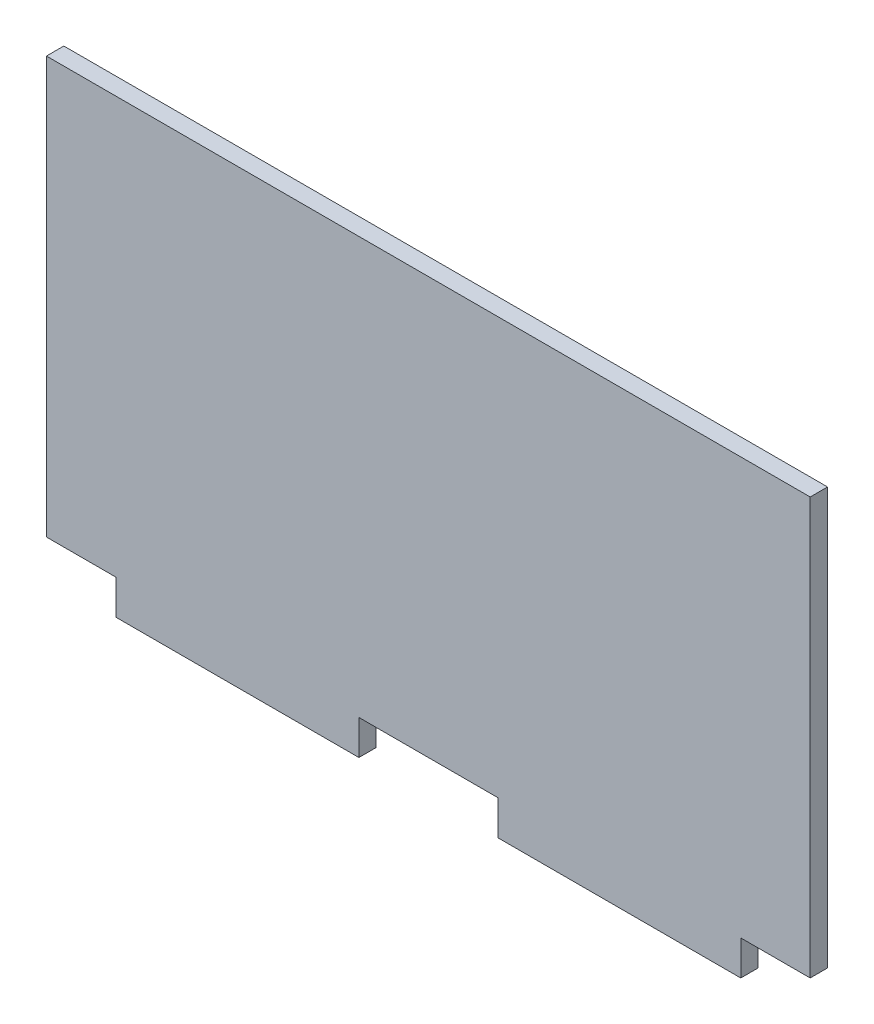
ISO-10303-21;
HEADER;
FILE_DESCRIPTION(('STEP AP214'),'2;1');
FILE_NAME('part.step','',(''),(''),'','','');
FILE_SCHEMA(('AUTOMOTIVE_DESIGN { 1 0 10303 214 1 1 1 1 }'));
ENDSEC;
DATA;
#1=APPLICATION_CONTEXT('core data for automotive mechanical design processes');
#2=APPLICATION_PROTOCOL_DEFINITION('international standard','automotive_design',2000,#1);
#3=PRODUCT_CONTEXT('',#1,'mechanical');
#4=PRODUCT('Part','Part','',(#3));
#5=PRODUCT_RELATED_PRODUCT_CATEGORY('part','',(#4));
#6=PRODUCT_DEFINITION_FORMATION('','',#4);
#7=PRODUCT_DEFINITION_CONTEXT('part definition',#1,'design');
#8=PRODUCT_DEFINITION('design','',#6,#7);
#9=PRODUCT_DEFINITION_SHAPE('','',#8);
#10=(LENGTH_UNIT() NAMED_UNIT(*) SI_UNIT(.MILLI.,.METRE.));
#11=(NAMED_UNIT(*) PLANE_ANGLE_UNIT() SI_UNIT($,.RADIAN.));
#12=(NAMED_UNIT(*) SI_UNIT($,.STERADIAN.) SOLID_ANGLE_UNIT());
#13=UNCERTAINTY_MEASURE_WITH_UNIT(LENGTH_MEASURE(1.E-05),#10,'distance_accuracy_value','');
#14=(GEOMETRIC_REPRESENTATION_CONTEXT(3) GLOBAL_UNCERTAINTY_ASSIGNED_CONTEXT((#13)) GLOBAL_UNIT_ASSIGNED_CONTEXT((#10,
#11,#12)) REPRESENTATION_CONTEXT('',''));
#15=CARTESIAN_POINT('',(0.,0.,0.));
#16=DIRECTION('',(0.,0.,1.));
#17=DIRECTION('',(1.,0.,0.));
#18=AXIS2_PLACEMENT_3D('',#15,#16,#17);
#19=CARTESIAN_POINT('',(144.376012965964,120.,5.));
#20=DIRECTION('',(0.,-1.,0.));
#21=DIRECTION('',(1.,0.,0.));
#22=AXIS2_PLACEMENT_3D('',#19,#20,#21);
#23=PLANE('',#22);
#24=DIRECTION('',(-1.,0.,0.));
#25=VECTOR('',#24,1.);
#26=CARTESIAN_POINT('',(144.376012965964,120.,0.));
#27=LINE('',#26,#25);
#28=CARTESIAN_POINT('',(144.376012965964,120.,0.));
#29=VERTEX_POINT('',#28);
#30=CARTESIAN_POINT('',(-75.6239870340357,120.,0.));
#31=VERTEX_POINT('',#30);
#32=EDGE_CURVE('E170',#29,#31,#27,.T.);
#33=ORIENTED_EDGE('',*,*,#32,.T.);
#34=DIRECTION('',(0.,0.,-1.));
#35=VECTOR('',#34,1.);
#36=CARTESIAN_POINT('',(-75.6239870340357,120.,5.));
#37=LINE('',#36,#35);
#38=CARTESIAN_POINT('',(-75.6239870340357,120.,5.));
#39=VERTEX_POINT('',#38);
#40=EDGE_CURVE('E11',#39,#31,#37,.T.);
#41=ORIENTED_EDGE('',*,*,#40,.F.);
#42=DIRECTION('',(-1.,0.,0.));
#43=VECTOR('',#42,1.);
#44=CARTESIAN_POINT('',(144.376012965964,120.,5.));
#45=LINE('',#44,#43);
#46=CARTESIAN_POINT('',(144.376012965964,120.,5.));
#47=VERTEX_POINT('',#46);
#48=EDGE_CURVE('E204',#47,#39,#45,.T.);
#49=ORIENTED_EDGE('',*,*,#48,.F.);
#50=DIRECTION('',(0.,0.,-1.));
#51=VECTOR('',#50,1.);
#52=CARTESIAN_POINT('',(144.376012965964,120.,5.));
#53=LINE('',#52,#51);
#54=EDGE_CURVE('E166',#47,#29,#53,.T.);
#55=ORIENTED_EDGE('',*,*,#54,.T.);
#56=EDGE_LOOP('',(#33,#41,#49,#55));
#57=FACE_BOUND('',#56,.T.);
#58=ADVANCED_FACE('F45',(#57),#23,.F.);
#59=CARTESIAN_POINT('',(-75.6239870340357,120.,5.));
#60=DIRECTION('',(1.,0.,0.));
#61=DIRECTION('',(0.,1.,0.));
#62=AXIS2_PLACEMENT_3D('',#59,#60,#61);
#63=PLANE('',#62);
#64=DIRECTION('',(0.,-1.,0.));
#65=VECTOR('',#64,1.);
#66=CARTESIAN_POINT('',(-75.6239870340357,120.,0.));
#67=LINE('',#66,#65);
#68=CARTESIAN_POINT('',(-75.6239870340357,0.,0.));
#69=VERTEX_POINT('',#68);
#70=EDGE_CURVE('E174',#31,#69,#67,.T.);
#71=ORIENTED_EDGE('',*,*,#70,.T.);
#72=DIRECTION('',(0.,0.,-1.));
#73=VECTOR('',#72,1.);
#74=CARTESIAN_POINT('',(-75.6239870340357,0.,5.));
#75=LINE('',#74,#73);
#76=CARTESIAN_POINT('',(-75.6239870340357,0.,5.));
#77=VERTEX_POINT('',#76);
#78=EDGE_CURVE('E54',#77,#69,#75,.T.);
#79=ORIENTED_EDGE('',*,*,#78,.F.);
#80=DIRECTION('',(0.,-1.,0.));
#81=VECTOR('',#80,1.);
#82=CARTESIAN_POINT('',(-75.6239870340357,120.,5.));
#83=LINE('',#82,#81);
#84=EDGE_CURVE('E117',#39,#77,#83,.T.);
#85=ORIENTED_EDGE('',*,*,#84,.F.);
#86=ORIENTED_EDGE('',*,*,#40,.T.);
#87=EDGE_LOOP('',(#71,#79,#85,#86));
#88=FACE_BOUND('',#87,.T.);
#89=ADVANCED_FACE('F298',(#88),#63,.F.);
#90=CARTESIAN_POINT('',(-75.6239870340357,0.,5.));
#91=DIRECTION('',(0.,1.,0.));
#92=DIRECTION('',(0.,0.,1.));
#93=AXIS2_PLACEMENT_3D('',#90,#91,#92);
#94=PLANE('',#93);
#95=DIRECTION('',(1.,0.,0.));
#96=VECTOR('',#95,1.);
#97=CARTESIAN_POINT('',(-75.6239870340357,0.,0.));
#98=LINE('',#97,#96);
#99=CARTESIAN_POINT('',(-55.6239870340357,0.,0.));
#100=VERTEX_POINT('',#99);
#101=EDGE_CURVE('E177',#69,#100,#98,.T.);
#102=ORIENTED_EDGE('',*,*,#101,.T.);
#103=DIRECTION('',(0.,0.,-1.));
#104=VECTOR('',#103,1.);
#105=CARTESIAN_POINT('',(-55.6239870340357,0.,5.));
#106=LINE('',#105,#104);
#107=CARTESIAN_POINT('',(-55.6239870340357,0.,5.));
#108=VERTEX_POINT('',#107);
#109=EDGE_CURVE('E231',#108,#100,#106,.T.);
#110=ORIENTED_EDGE('',*,*,#109,.F.);
#111=DIRECTION('',(1.,0.,0.));
#112=VECTOR('',#111,1.);
#113=CARTESIAN_POINT('',(-75.6239870340357,0.,5.));
#114=LINE('',#113,#112);
#115=EDGE_CURVE('E241',#77,#108,#114,.T.);
#116=ORIENTED_EDGE('',*,*,#115,.F.);
#117=ORIENTED_EDGE('',*,*,#78,.T.);
#118=EDGE_LOOP('',(#102,#110,#116,#117));
#119=FACE_BOUND('',#118,.T.);
#120=ADVANCED_FACE('F239',(#119),#94,.F.);
#121=CARTESIAN_POINT('',(-55.6239870340357,0.,5.));
#122=DIRECTION('',(1.,0.,0.));
#123=DIRECTION('',(0.,0.,-1.));
#124=AXIS2_PLACEMENT_3D('',#121,#122,#123);
#125=PLANE('',#124);
#126=DIRECTION('',(0.,-1.,0.));
#127=VECTOR('',#126,1.);
#128=CARTESIAN_POINT('',(-55.6239870340357,0.,0.));
#129=LINE('',#128,#127);
#130=CARTESIAN_POINT('',(-55.6239870340357,-10.,0.));
#131=VERTEX_POINT('',#130);
#132=EDGE_CURVE('E180',#100,#131,#129,.T.);
#133=ORIENTED_EDGE('',*,*,#132,.T.);
#134=DIRECTION('',(0.,0.,-1.));
#135=VECTOR('',#134,1.);
#136=CARTESIAN_POINT('',(-55.6239870340357,-10.,5.));
#137=LINE('',#136,#135);
#138=CARTESIAN_POINT('',(-55.6239870340357,-10.,5.));
#139=VERTEX_POINT('',#138);
#140=EDGE_CURVE('E227',#139,#131,#137,.T.);
#141=ORIENTED_EDGE('',*,*,#140,.F.);
#142=DIRECTION('',(0.,-1.,0.));
#143=VECTOR('',#142,1.);
#144=CARTESIAN_POINT('',(-55.6239870340357,0.,5.));
#145=LINE('',#144,#143);
#146=EDGE_CURVE('E260',#108,#139,#145,.T.);
#147=ORIENTED_EDGE('',*,*,#146,.F.);
#148=ORIENTED_EDGE('',*,*,#109,.T.);
#149=EDGE_LOOP('',(#133,#141,#147,#148));
#150=FACE_BOUND('',#149,.T.);
#151=ADVANCED_FACE('F250',(#150),#125,.F.);
#152=CARTESIAN_POINT('',(-55.6239870340357,-10.,5.));
#153=DIRECTION('',(0.,1.,0.));
#154=DIRECTION('',(0.,0.,1.));
#155=AXIS2_PLACEMENT_3D('',#152,#153,#154);
#156=PLANE('',#155);
#157=DIRECTION('',(1.,0.,0.));
#158=VECTOR('',#157,1.);
#159=CARTESIAN_POINT('',(-55.6239870340357,-10.,0.));
#160=LINE('',#159,#158);
#161=CARTESIAN_POINT('',(14.3760129659643,-10.,0.));
#162=VERTEX_POINT('',#161);
#163=EDGE_CURVE('E183',#131,#162,#160,.T.);
#164=ORIENTED_EDGE('',*,*,#163,.T.);
#165=DIRECTION('',(0.,0.,-1.));
#166=VECTOR('',#165,1.);
#167=CARTESIAN_POINT('',(14.3760129659643,-10.,5.));
#168=LINE('',#167,#166);
#169=CARTESIAN_POINT('',(14.3760129659643,-10.,5.));
#170=VERTEX_POINT('',#169);
#171=EDGE_CURVE('E223',#170,#162,#168,.T.);
#172=ORIENTED_EDGE('',*,*,#171,.F.);
#173=DIRECTION('',(1.,0.,0.));
#174=VECTOR('',#173,1.);
#175=CARTESIAN_POINT('',(-55.6239870340357,-10.,5.));
#176=LINE('',#175,#174);
#177=EDGE_CURVE('E256',#139,#170,#176,.T.);
#178=ORIENTED_EDGE('',*,*,#177,.F.);
#179=ORIENTED_EDGE('',*,*,#140,.T.);
#180=EDGE_LOOP('',(#164,#172,#178,#179));
#181=FACE_BOUND('',#180,.T.);
#182=ADVANCED_FACE('F254',(#181),#156,.F.);
#183=CARTESIAN_POINT('',(14.3760129659643,-10.,5.));
#184=DIRECTION('',(-1.,0.,0.));
#185=DIRECTION('',(0.,0.,1.));
#186=AXIS2_PLACEMENT_3D('',#183,#184,#185);
#187=PLANE('',#186);
#188=DIRECTION('',(0.,1.,0.));
#189=VECTOR('',#188,1.);
#190=CARTESIAN_POINT('',(14.3760129659643,-10.,0.));
#191=LINE('',#190,#189);
#192=CARTESIAN_POINT('',(14.3760129659643,0.,0.));
#193=VERTEX_POINT('',#192);
#194=EDGE_CURVE('E186',#162,#193,#191,.T.);
#195=ORIENTED_EDGE('',*,*,#194,.T.);
#196=DIRECTION('',(0.,0.,-1.));
#197=VECTOR('',#196,1.);
#198=CARTESIAN_POINT('',(14.3760129659643,0.,5.));
#199=LINE('',#198,#197);
#200=CARTESIAN_POINT('',(14.3760129659643,0.,5.));
#201=VERTEX_POINT('',#200);
#202=EDGE_CURVE('E219',#201,#193,#199,.T.);
#203=ORIENTED_EDGE('',*,*,#202,.F.);
#204=DIRECTION('',(0.,1.,0.));
#205=VECTOR('',#204,1.);
#206=CARTESIAN_POINT('',(14.3760129659643,-10.,5.));
#207=LINE('',#206,#205);
#208=EDGE_CURVE('E259',#170,#201,#207,.T.);
#209=ORIENTED_EDGE('',*,*,#208,.F.);
#210=ORIENTED_EDGE('',*,*,#171,.T.);
#211=EDGE_LOOP('',(#195,#203,#209,#210));
#212=FACE_BOUND('',#211,.T.);
#213=ADVANCED_FACE('F311',(#212),#187,.F.);
#214=CARTESIAN_POINT('',(14.3760129659643,0.,5.));
#215=DIRECTION('',(0.,1.,0.));
#216=DIRECTION('',(0.,0.,1.));
#217=AXIS2_PLACEMENT_3D('',#214,#215,#216);
#218=PLANE('',#217);
#219=DIRECTION('',(1.,0.,0.));
#220=VECTOR('',#219,1.);
#221=CARTESIAN_POINT('',(14.3760129659643,0.,0.));
#222=LINE('',#221,#220);
#223=CARTESIAN_POINT('',(54.3760129659643,0.,0.));
#224=VERTEX_POINT('',#223);
#225=EDGE_CURVE('E189',#193,#224,#222,.T.);
#226=ORIENTED_EDGE('',*,*,#225,.T.);
#227=DIRECTION('',(0.,0.,-1.));
#228=VECTOR('',#227,1.);
#229=CARTESIAN_POINT('',(54.3760129659643,0.,5.));
#230=LINE('',#229,#228);
#231=CARTESIAN_POINT('',(54.3760129659643,0.,5.));
#232=VERTEX_POINT('',#231);
#233=EDGE_CURVE('E215',#232,#224,#230,.T.);
#234=ORIENTED_EDGE('',*,*,#233,.F.);
#235=DIRECTION('',(1.,0.,0.));
#236=VECTOR('',#235,1.);
#237=CARTESIAN_POINT('',(14.3760129659643,0.,5.));
#238=LINE('',#237,#236);
#239=EDGE_CURVE('E264',#201,#232,#238,.T.);
#240=ORIENTED_EDGE('',*,*,#239,.F.);
#241=ORIENTED_EDGE('',*,*,#202,.T.);
#242=EDGE_LOOP('',(#226,#234,#240,#241));
#243=FACE_BOUND('',#242,.T.);
#244=ADVANCED_FACE('F314',(#243),#218,.F.);
#245=CARTESIAN_POINT('',(54.3760129659643,0.,5.));
#246=DIRECTION('',(1.,0.,0.));
#247=DIRECTION('',(0.,0.,-1.));
#248=AXIS2_PLACEMENT_3D('',#245,#246,#247);
#249=PLANE('',#248);
#250=DIRECTION('',(0.,-1.,0.));
#251=VECTOR('',#250,1.);
#252=CARTESIAN_POINT('',(54.3760129659643,0.,0.));
#253=LINE('',#252,#251);
#254=CARTESIAN_POINT('',(54.3760129659643,-10.,0.));
#255=VERTEX_POINT('',#254);
#256=EDGE_CURVE('E192',#224,#255,#253,.T.);
#257=ORIENTED_EDGE('',*,*,#256,.T.);
#258=DIRECTION('',(0.,0.,-1.));
#259=VECTOR('',#258,1.);
#260=CARTESIAN_POINT('',(54.3760129659643,-10.,5.));
#261=LINE('',#260,#259);
#262=CARTESIAN_POINT('',(54.3760129659643,-10.,5.));
#263=VERTEX_POINT('',#262);
#264=EDGE_CURVE('E211',#263,#255,#261,.T.);
#265=ORIENTED_EDGE('',*,*,#264,.F.);
#266=DIRECTION('',(0.,-1.,0.));
#267=VECTOR('',#266,1.);
#268=CARTESIAN_POINT('',(54.3760129659643,0.,5.));
#269=LINE('',#268,#267);
#270=EDGE_CURVE('E271',#232,#263,#269,.T.);
#271=ORIENTED_EDGE('',*,*,#270,.F.);
#272=ORIENTED_EDGE('',*,*,#233,.T.);
#273=EDGE_LOOP('',(#257,#265,#271,#272));
#274=FACE_BOUND('',#273,.T.);
#275=ADVANCED_FACE('F279',(#274),#249,.F.);
#276=CARTESIAN_POINT('',(54.3760129659643,-10.,5.));
#277=DIRECTION('',(0.,1.,0.));
#278=DIRECTION('',(0.,0.,1.));
#279=AXIS2_PLACEMENT_3D('',#276,#277,#278);
#280=PLANE('',#279);
#281=DIRECTION('',(1.,0.,0.));
#282=VECTOR('',#281,1.);
#283=CARTESIAN_POINT('',(54.3760129659643,-10.,0.));
#284=LINE('',#283,#282);
#285=CARTESIAN_POINT('',(124.376012965964,-10.,0.));
#286=VERTEX_POINT('',#285);
#287=EDGE_CURVE('E195',#255,#286,#284,.T.);
#288=ORIENTED_EDGE('',*,*,#287,.T.);
#289=DIRECTION('',(0.,0.,-1.));
#290=VECTOR('',#289,1.);
#291=CARTESIAN_POINT('',(124.376012965964,-10.,5.));
#292=LINE('',#291,#290);
#293=CARTESIAN_POINT('',(124.376012965964,-10.,5.));
#294=VERTEX_POINT('',#293);
#295=EDGE_CURVE('E159',#294,#286,#292,.T.);
#296=ORIENTED_EDGE('',*,*,#295,.F.);
#297=DIRECTION('',(1.,0.,0.));
#298=VECTOR('',#297,1.);
#299=CARTESIAN_POINT('',(54.3760129659643,-10.,5.));
#300=LINE('',#299,#298);
#301=EDGE_CURVE('E148',#263,#294,#300,.T.);
#302=ORIENTED_EDGE('',*,*,#301,.F.);
#303=ORIENTED_EDGE('',*,*,#264,.T.);
#304=EDGE_LOOP('',(#288,#296,#302,#303));
#305=FACE_BOUND('',#304,.T.);
#306=ADVANCED_FACE('F283',(#305),#280,.F.);
#307=CARTESIAN_POINT('',(124.376012965964,-10.,5.));
#308=DIRECTION('',(-1.,0.,0.));
#309=DIRECTION('',(0.,0.,1.));
#310=AXIS2_PLACEMENT_3D('',#307,#308,#309);
#311=PLANE('',#310);
#312=DIRECTION('',(0.,1.,0.));
#313=VECTOR('',#312,1.);
#314=CARTESIAN_POINT('',(124.376012965964,-10.,0.));
#315=LINE('',#314,#313);
#316=CARTESIAN_POINT('',(124.376012965964,0.,0.));
#317=VERTEX_POINT('',#316);
#318=EDGE_CURVE('E157',#286,#317,#315,.T.);
#319=ORIENTED_EDGE('',*,*,#318,.T.);
#320=DIRECTION('',(0.,0.,-1.));
#321=VECTOR('',#320,1.);
#322=CARTESIAN_POINT('',(124.376012965964,0.,5.));
#323=LINE('',#322,#321);
#324=CARTESIAN_POINT('',(124.376012965964,0.,5.));
#325=VERTEX_POINT('',#324);
#326=EDGE_CURVE('E154',#325,#317,#323,.T.);
#327=ORIENTED_EDGE('',*,*,#326,.F.);
#328=DIRECTION('',(0.,1.,0.));
#329=VECTOR('',#328,1.);
#330=CARTESIAN_POINT('',(124.376012965964,-10.,5.));
#331=LINE('',#330,#329);
#332=EDGE_CURVE('E142',#294,#325,#331,.T.);
#333=ORIENTED_EDGE('',*,*,#332,.F.);
#334=ORIENTED_EDGE('',*,*,#295,.T.);
#335=EDGE_LOOP('',(#319,#327,#333,#334));
#336=FACE_BOUND('',#335,.T.);
#337=ADVANCED_FACE('F155',(#336),#311,.F.);
#338=CARTESIAN_POINT('',(124.376012965964,0.,5.));
#339=DIRECTION('',(0.,1.,0.));
#340=DIRECTION('',(0.,0.,1.));
#341=AXIS2_PLACEMENT_3D('',#338,#339,#340);
#342=PLANE('',#341);
#343=DIRECTION('',(1.,0.,0.));
#344=VECTOR('',#343,1.);
#345=CARTESIAN_POINT('',(124.376012965964,0.,0.));
#346=LINE('',#345,#344);
#347=CARTESIAN_POINT('',(144.376012965964,0.,0.));
#348=VERTEX_POINT('',#347);
#349=EDGE_CURVE('E103',#317,#348,#346,.T.);
#350=ORIENTED_EDGE('',*,*,#349,.T.);
#351=DIRECTION('',(0.,0.,-1.));
#352=VECTOR('',#351,1.);
#353=CARTESIAN_POINT('',(144.376012965964,0.,5.));
#354=LINE('',#353,#352);
#355=CARTESIAN_POINT('',(144.376012965964,0.,5.));
#356=VERTEX_POINT('',#355);
#357=EDGE_CURVE('E160',#356,#348,#354,.T.);
#358=ORIENTED_EDGE('',*,*,#357,.F.);
#359=DIRECTION('',(1.,0.,0.));
#360=VECTOR('',#359,1.);
#361=CARTESIAN_POINT('',(124.376012965964,0.,5.));
#362=LINE('',#361,#360);
#363=EDGE_CURVE('E146',#325,#356,#362,.T.);
#364=ORIENTED_EDGE('',*,*,#363,.F.);
#365=ORIENTED_EDGE('',*,*,#326,.T.);
#366=EDGE_LOOP('',(#350,#358,#364,#365));
#367=FACE_BOUND('',#366,.T.);
#368=ADVANCED_FACE('F162',(#367),#342,.F.);
#369=CARTESIAN_POINT('',(144.376012965964,0.,5.));
#370=DIRECTION('',(-1.,0.,0.));
#371=DIRECTION('',(0.,0.,1.));
#372=AXIS2_PLACEMENT_3D('',#369,#370,#371);
#373=PLANE('',#372);
#374=DIRECTION('',(0.,1.,0.));
#375=VECTOR('',#374,1.);
#376=CARTESIAN_POINT('',(144.376012965964,0.,0.));
#377=LINE('',#376,#375);
#378=EDGE_CURVE('E109',#348,#29,#377,.T.);
#379=ORIENTED_EDGE('',*,*,#378,.T.);
#380=ORIENTED_EDGE('',*,*,#54,.F.);
#381=DIRECTION('',(0.,1.,0.));
#382=VECTOR('',#381,1.);
#383=CARTESIAN_POINT('',(144.376012965964,0.,5.));
#384=LINE('',#383,#382);
#385=EDGE_CURVE('E62',#356,#47,#384,.T.);
#386=ORIENTED_EDGE('',*,*,#385,.F.);
#387=ORIENTED_EDGE('',*,*,#357,.T.);
#388=EDGE_LOOP('',(#379,#380,#386,#387));
#389=FACE_BOUND('',#388,.T.);
#390=ADVANCED_FACE('F287',(#389),#373,.F.);
#391=CARTESIAN_POINT('',(0.,0.,5.));
#392=DIRECTION('',(0.,0.,1.));
#393=DIRECTION('',(1.,0.,0.));
#394=AXIS2_PLACEMENT_3D('',#391,#392,#393);
#395=PLANE('',#394);
#396=ORIENTED_EDGE('',*,*,#48,.T.);
#397=ORIENTED_EDGE('',*,*,#84,.T.);
#398=ORIENTED_EDGE('',*,*,#115,.T.);
#399=ORIENTED_EDGE('',*,*,#146,.T.);
#400=ORIENTED_EDGE('',*,*,#177,.T.);
#401=ORIENTED_EDGE('',*,*,#208,.T.);
#402=ORIENTED_EDGE('',*,*,#239,.T.);
#403=ORIENTED_EDGE('',*,*,#270,.T.);
#404=ORIENTED_EDGE('',*,*,#301,.T.);
#405=ORIENTED_EDGE('',*,*,#332,.T.);
#406=ORIENTED_EDGE('',*,*,#363,.T.);
#407=ORIENTED_EDGE('',*,*,#385,.T.);
#408=EDGE_LOOP('',(#396,#397,#398,#399,#400,#401,#402,#403,#404,#405,#406,#407));
#409=FACE_BOUND('',#408,.T.);
#410=ADVANCED_FACE('F144',(#409),#395,.T.);
#411=CARTESIAN_POINT('',(0.,0.,0.));
#412=DIRECTION('',(0.,0.,1.));
#413=DIRECTION('',(1.,0.,0.));
#414=AXIS2_PLACEMENT_3D('',#411,#412,#413);
#415=PLANE('',#414);
#416=ORIENTED_EDGE('',*,*,#32,.F.);
#417=ORIENTED_EDGE('',*,*,#378,.F.);
#418=ORIENTED_EDGE('',*,*,#349,.F.);
#419=ORIENTED_EDGE('',*,*,#318,.F.);
#420=ORIENTED_EDGE('',*,*,#287,.F.);
#421=ORIENTED_EDGE('',*,*,#256,.F.);
#422=ORIENTED_EDGE('',*,*,#225,.F.);
#423=ORIENTED_EDGE('',*,*,#194,.F.);
#424=ORIENTED_EDGE('',*,*,#163,.F.);
#425=ORIENTED_EDGE('',*,*,#132,.F.);
#426=ORIENTED_EDGE('',*,*,#101,.F.);
#427=ORIENTED_EDGE('',*,*,#70,.F.);
#428=EDGE_LOOP('',(#416,#417,#418,#419,#420,#421,#422,#423,#424,#425,#426,#427));
#429=FACE_BOUND('',#428,.T.);
#430=ADVANCED_FACE('F245',(#429),#415,.F.);
#431=CLOSED_SHELL('',(#58,#89,#120,#151,#182,#213,#244,#275,#306,#337,#368,#390,#410,#430));
#432=MANIFOLD_SOLID_BREP('B2',#431);
#433=ADVANCED_BREP_SHAPE_REPRESENTATION('',(#18,#432),#14);
#434=SHAPE_DEFINITION_REPRESENTATION(#9,#433);
ENDSEC;
END-ISO-10303-21;
